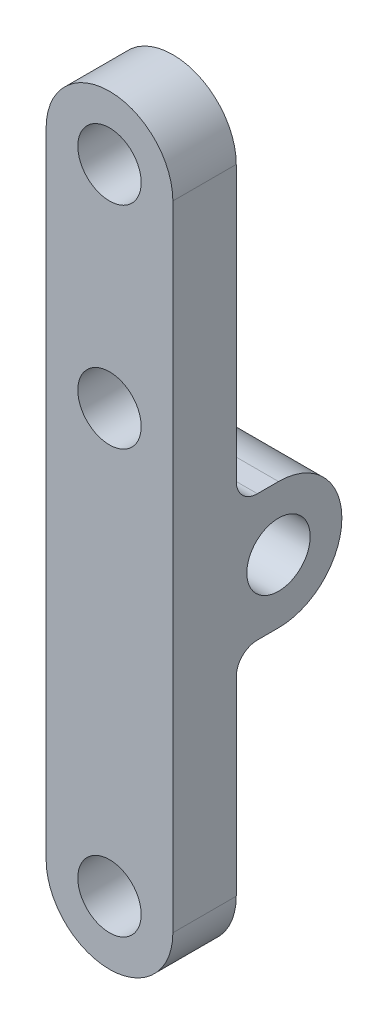
ISO-10303-21;
HEADER;
FILE_DESCRIPTION(('STEP AP214'),'2;1');
FILE_NAME('part.step','',(''),(''),'','','');
FILE_SCHEMA(('AUTOMOTIVE_DESIGN { 1 0 10303 214 1 1 1 1 }'));
ENDSEC;
DATA;
#1=APPLICATION_CONTEXT('core data for automotive mechanical design processes');
#2=APPLICATION_PROTOCOL_DEFINITION('international standard','automotive_design',2000,#1);
#3=PRODUCT_CONTEXT('',#1,'mechanical');
#4=PRODUCT('Part','Part','',(#3));
#5=PRODUCT_RELATED_PRODUCT_CATEGORY('part','',(#4));
#6=PRODUCT_DEFINITION_FORMATION('','',#4);
#7=PRODUCT_DEFINITION_CONTEXT('part definition',#1,'design');
#8=PRODUCT_DEFINITION('design','',#6,#7);
#9=PRODUCT_DEFINITION_SHAPE('','',#8);
#10=(LENGTH_UNIT() NAMED_UNIT(*) SI_UNIT(.MILLI.,.METRE.));
#11=(NAMED_UNIT(*) PLANE_ANGLE_UNIT() SI_UNIT($,.RADIAN.));
#12=(NAMED_UNIT(*) SI_UNIT($,.STERADIAN.) SOLID_ANGLE_UNIT());
#13=UNCERTAINTY_MEASURE_WITH_UNIT(LENGTH_MEASURE(1.E-05),#10,'distance_accuracy_value','');
#14=(GEOMETRIC_REPRESENTATION_CONTEXT(3) GLOBAL_UNCERTAINTY_ASSIGNED_CONTEXT((#13)) GLOBAL_UNIT_ASSIGNED_CONTEXT((#10,
#11,#12)) REPRESENTATION_CONTEXT('',''));
#15=CARTESIAN_POINT('',(0.,0.,0.));
#16=DIRECTION('',(0.,0.,1.));
#17=DIRECTION('',(1.,0.,0.));
#18=AXIS2_PLACEMENT_3D('',#15,#16,#17);
#19=CARTESIAN_POINT('',(0.,0.,-3.));
#20=DIRECTION('',(0.,0.,-1.));
#21=DIRECTION('',(1.,0.,0.));
#22=AXIS2_PLACEMENT_3D('',#19,#20,#21);
#23=PLANE('',#22);
#24=CARTESIAN_POINT('',(0.,-10.,-3.));
#25=DIRECTION('',(0.,0.,1.));
#26=DIRECTION('',(1.,0.,0.));
#27=AXIS2_PLACEMENT_3D('',#24,#25,#26);
#28=CIRCLE('',#27,1.5);
#29=CARTESIAN_POINT('',(1.5,-10.,-3.));
#30=VERTEX_POINT('',#29);
#31=EDGE_CURVE('E218',#30,#30,#28,.T.);
#32=ORIENTED_EDGE('',*,*,#31,.T.);
#33=EDGE_LOOP('',(#32));
#34=FACE_BOUND('',#33,.T.);
#35=DIRECTION('',(0.,-1.,0.));
#36=VECTOR('',#35,1.);
#37=CARTESIAN_POINT('',(-3.,0.,-3.));
#38=LINE('',#37,#36);
#39=CARTESIAN_POINT('',(-3.,0.,-3.));
#40=VERTEX_POINT('',#39);
#41=CARTESIAN_POINT('',(-3.,-13.,-3.));
#42=VERTEX_POINT('',#41);
#43=EDGE_CURVE('E162',#40,#42,#38,.T.);
#44=ORIENTED_EDGE('',*,*,#43,.F.);
#45=CARTESIAN_POINT('',(0.,0.,-3.));
#46=DIRECTION('',(0.,0.,1.));
#47=DIRECTION('',(1.,0.,0.));
#48=AXIS2_PLACEMENT_3D('',#45,#46,#47);
#49=CIRCLE('',#48,3.);
#50=CARTESIAN_POINT('',(3.,0.,-3.));
#51=VERTEX_POINT('',#50);
#52=EDGE_CURVE('E157',#51,#40,#49,.T.);
#53=ORIENTED_EDGE('',*,*,#52,.F.);
#54=DIRECTION('',(0.,1.,0.));
#55=VECTOR('',#54,1.);
#56=CARTESIAN_POINT('',(3.,0.,-3.));
#57=LINE('',#56,#55);
#58=CARTESIAN_POINT('',(3.,-13.,-3.));
#59=VERTEX_POINT('',#58);
#60=EDGE_CURVE('E168',#59,#51,#57,.T.);
#61=ORIENTED_EDGE('',*,*,#60,.F.);
#62=DIRECTION('',(-1.,0.,0.));
#63=VECTOR('',#62,1.);
#64=CARTESIAN_POINT('',(3.,-13.,-3.));
#65=LINE('',#64,#63);
#66=EDGE_CURVE('E196',#42,#59,#65,.F.);
#67=ORIENTED_EDGE('',*,*,#66,.F.);
#68=EDGE_LOOP('',(#44,#53,#61,#67));
#69=FACE_BOUND('',#68,.T.);
#70=CARTESIAN_POINT('',(0.,0.,-3.));
#71=DIRECTION('',(0.,0.,1.));
#72=DIRECTION('',(1.,0.,0.));
#73=AXIS2_PLACEMENT_3D('',#70,#71,#72);
#74=CIRCLE('',#73,1.5);
#75=CARTESIAN_POINT('',(1.5,0.,-3.));
#76=VERTEX_POINT('',#75);
#77=EDGE_CURVE('E151',#76,#76,#74,.T.);
#78=ORIENTED_EDGE('',*,*,#77,.T.);
#79=EDGE_LOOP('',(#78));
#80=FACE_BOUND('',#79,.T.);
#81=ADVANCED_FACE('F35',(#34,#69,#80),#23,.T.);
#82=CARTESIAN_POINT('',(3.,-30.,-3.));
#83=VERTEX_POINT('',#82);
#84=CARTESIAN_POINT('',(3.,-21.,-3.));
#85=VERTEX_POINT('',#84);
#86=EDGE_CURVE('E169',#83,#85,#57,.T.);
#87=ORIENTED_EDGE('',*,*,#86,.F.);
#88=CARTESIAN_POINT('',(0.,-30.,-3.));
#89=DIRECTION('',(0.,0.,1.));
#90=DIRECTION('',(-1.,0.,0.));
#91=AXIS2_PLACEMENT_3D('',#88,#89,#90);
#92=CIRCLE('',#91,3.);
#93=CARTESIAN_POINT('',(-3.,-30.,-3.));
#94=VERTEX_POINT('',#93);
#95=EDGE_CURVE('E165',#94,#83,#92,.T.);
#96=ORIENTED_EDGE('',*,*,#95,.F.);
#97=CARTESIAN_POINT('',(-3.,-21.,-3.));
#98=VERTEX_POINT('',#97);
#99=EDGE_CURVE('E160',#98,#94,#38,.T.);
#100=ORIENTED_EDGE('',*,*,#99,.F.);
#101=DIRECTION('',(1.,0.,0.));
#102=VECTOR('',#101,1.);
#103=CARTESIAN_POINT('',(-3.,-21.,-3.));
#104=LINE('',#103,#102);
#105=EDGE_CURVE('E192',#85,#98,#104,.F.);
#106=ORIENTED_EDGE('',*,*,#105,.F.);
#107=EDGE_LOOP('',(#87,#96,#100,#106));
#108=FACE_BOUND('',#107,.T.);
#109=CARTESIAN_POINT('',(0.,-30.,-3.));
#110=DIRECTION('',(0.,0.,1.));
#111=DIRECTION('',(-1.,0.,0.));
#112=AXIS2_PLACEMENT_3D('',#109,#110,#111);
#113=CIRCLE('',#112,1.5);
#114=CARTESIAN_POINT('',(-1.5,-30.,-3.));
#115=VERTEX_POINT('',#114);
#116=EDGE_CURVE('E145',#115,#115,#113,.T.);
#117=ORIENTED_EDGE('',*,*,#116,.T.);
#118=EDGE_LOOP('',(#117));
#119=FACE_BOUND('',#118,.T.);
#120=ADVANCED_FACE('F241',(#108,#119),#23,.T.);
#121=CARTESIAN_POINT('',(0.,0.,0.));
#122=DIRECTION('',(0.,0.,-1.));
#123=DIRECTION('',(1.,0.,0.));
#124=AXIS2_PLACEMENT_3D('',#121,#122,#123);
#125=PLANE('',#124);
#126=CARTESIAN_POINT('',(0.,-10.,0.));
#127=DIRECTION('',(0.,0.,-1.));
#128=DIRECTION('',(-1.,0.,0.));
#129=AXIS2_PLACEMENT_3D('',#126,#127,#128);
#130=CIRCLE('',#129,1.5);
#131=CARTESIAN_POINT('',(-1.5,-10.,0.));
#132=VERTEX_POINT('',#131);
#133=EDGE_CURVE('E221',#132,#132,#130,.T.);
#134=ORIENTED_EDGE('',*,*,#133,.T.);
#135=EDGE_LOOP('',(#134));
#136=FACE_BOUND('',#135,.T.);
#137=CARTESIAN_POINT('',(0.,-30.,0.));
#138=DIRECTION('',(0.,0.,1.));
#139=DIRECTION('',(-1.,0.,0.));
#140=AXIS2_PLACEMENT_3D('',#137,#138,#139);
#141=CIRCLE('',#140,3.);
#142=CARTESIAN_POINT('',(-3.,-30.,0.));
#143=VERTEX_POINT('',#142);
#144=CARTESIAN_POINT('',(3.,-30.,0.));
#145=VERTEX_POINT('',#144);
#146=EDGE_CURVE('E178',#143,#145,#141,.T.);
#147=ORIENTED_EDGE('',*,*,#146,.T.);
#148=DIRECTION('',(0.,1.,0.));
#149=VECTOR('',#148,1.);
#150=CARTESIAN_POINT('',(3.,0.,0.));
#151=LINE('',#150,#149);
#152=CARTESIAN_POINT('',(3.,0.,0.));
#153=VERTEX_POINT('',#152);
#154=EDGE_CURVE('E161',#145,#153,#151,.T.);
#155=ORIENTED_EDGE('',*,*,#154,.T.);
#156=CARTESIAN_POINT('',(0.,0.,0.));
#157=DIRECTION('',(0.,0.,1.));
#158=DIRECTION('',(1.,0.,0.));
#159=AXIS2_PLACEMENT_3D('',#156,#157,#158);
#160=CIRCLE('',#159,3.);
#161=CARTESIAN_POINT('',(-3.,0.,0.));
#162=VERTEX_POINT('',#161);
#163=EDGE_CURVE('E154',#153,#162,#160,.T.);
#164=ORIENTED_EDGE('',*,*,#163,.T.);
#165=DIRECTION('',(0.,-1.,0.));
#166=VECTOR('',#165,1.);
#167=CARTESIAN_POINT('',(-3.,0.,0.));
#168=LINE('',#167,#166);
#169=EDGE_CURVE('E175',#162,#143,#168,.T.);
#170=ORIENTED_EDGE('',*,*,#169,.T.);
#171=EDGE_LOOP('',(#147,#155,#164,#170));
#172=FACE_BOUND('',#171,.T.);
#173=CARTESIAN_POINT('',(0.,-30.,0.));
#174=DIRECTION('',(0.,0.,1.));
#175=DIRECTION('',(-1.,0.,0.));
#176=AXIS2_PLACEMENT_3D('',#173,#174,#175);
#177=CIRCLE('',#176,1.5);
#178=CARTESIAN_POINT('',(-1.5,-30.,0.));
#179=VERTEX_POINT('',#178);
#180=EDGE_CURVE('E143',#179,#179,#177,.T.);
#181=ORIENTED_EDGE('',*,*,#180,.F.);
#182=EDGE_LOOP('',(#181));
#183=FACE_BOUND('',#182,.T.);
#184=CARTESIAN_POINT('',(0.,0.,0.));
#185=DIRECTION('',(0.,0.,1.));
#186=DIRECTION('',(1.,0.,0.));
#187=AXIS2_PLACEMENT_3D('',#184,#185,#186);
#188=CIRCLE('',#187,1.5);
#189=CARTESIAN_POINT('',(1.5,0.,0.));
#190=VERTEX_POINT('',#189);
#191=EDGE_CURVE('E148',#190,#190,#188,.T.);
#192=ORIENTED_EDGE('',*,*,#191,.F.);
#193=EDGE_LOOP('',(#192));
#194=FACE_BOUND('',#193,.T.);
#195=ADVANCED_FACE('F229',(#136,#172,#183,#194),#125,.F.);
#196=CARTESIAN_POINT('',(0.,0.,-3.));
#197=DIRECTION('',(0.,0.,1.));
#198=DIRECTION('',(-1.,0.,0.));
#199=AXIS2_PLACEMENT_3D('',#196,#197,#198);
#200=CYLINDRICAL_SURFACE('',#199,3.);
#201=ORIENTED_EDGE('',*,*,#163,.F.);
#202=DIRECTION('',(0.,0.,1.));
#203=VECTOR('',#202,1.);
#204=CARTESIAN_POINT('',(3.,0.,-3.));
#205=LINE('',#204,#203);
#206=EDGE_CURVE('E172',#51,#153,#205,.T.);
#207=ORIENTED_EDGE('',*,*,#206,.F.);
#208=ORIENTED_EDGE('',*,*,#52,.T.);
#209=DIRECTION('',(0.,0.,1.));
#210=VECTOR('',#209,1.);
#211=CARTESIAN_POINT('',(-3.,0.,-3.));
#212=LINE('',#211,#210);
#213=EDGE_CURVE('E188',#40,#162,#212,.T.);
#214=ORIENTED_EDGE('',*,*,#213,.T.);
#215=EDGE_LOOP('',(#201,#207,#208,#214));
#216=FACE_BOUND('',#215,.T.);
#217=ADVANCED_FACE('F254',(#216),#200,.T.);
#218=CARTESIAN_POINT('',(-3.,0.,-3.));
#219=DIRECTION('',(1.,0.,0.));
#220=DIRECTION('',(0.,1.,0.));
#221=AXIS2_PLACEMENT_3D('',#218,#219,#220);
#222=PLANE('',#221);
#223=ORIENTED_EDGE('',*,*,#99,.T.);
#224=DIRECTION('',(0.,0.,1.));
#225=VECTOR('',#224,1.);
#226=CARTESIAN_POINT('',(-3.,-30.,-3.));
#227=LINE('',#226,#225);
#228=EDGE_CURVE('E186',#94,#143,#227,.T.);
#229=ORIENTED_EDGE('',*,*,#228,.T.);
#230=ORIENTED_EDGE('',*,*,#169,.F.);
#231=ORIENTED_EDGE('',*,*,#213,.F.);
#232=ORIENTED_EDGE('',*,*,#43,.T.);
#233=CARTESIAN_POINT('',(-3.,-13.,-4.));
#234=DIRECTION('',(-1.,0.,0.));
#235=DIRECTION('',(0.,1.,0.));
#236=AXIS2_PLACEMENT_3D('',#233,#234,#235);
#237=CIRCLE('',#236,1.);
#238=CARTESIAN_POINT('',(-3.,-14.,-4.));
#239=VERTEX_POINT('',#238);
#240=EDGE_CURVE('E43',#239,#42,#237,.T.);
#241=ORIENTED_EDGE('',*,*,#240,.F.);
#242=DIRECTION('',(0.,0.,1.));
#243=VECTOR('',#242,1.);
#244=CARTESIAN_POINT('',(-3.,-14.,0.));
#245=LINE('',#244,#243);
#246=CARTESIAN_POINT('',(-3.,-14.,-5.));
#247=VERTEX_POINT('',#246);
#248=EDGE_CURVE('E144',#247,#239,#245,.T.);
#249=ORIENTED_EDGE('',*,*,#248,.F.);
#250=CARTESIAN_POINT('',(-3.,-17.,-5.));
#251=DIRECTION('',(-1.,0.,0.));
#252=DIRECTION('',(0.,1.,0.));
#253=AXIS2_PLACEMENT_3D('',#250,#251,#252);
#254=CIRCLE('',#253,3.);
#255=CARTESIAN_POINT('',(-3.,-20.,-5.));
#256=VERTEX_POINT('',#255);
#257=EDGE_CURVE('E118',#256,#247,#254,.F.);
#258=ORIENTED_EDGE('',*,*,#257,.F.);
#259=DIRECTION('',(0.,0.,-1.));
#260=VECTOR('',#259,1.);
#261=CARTESIAN_POINT('',(-3.,-20.,-5.));
#262=LINE('',#261,#260);
#263=CARTESIAN_POINT('',(-3.,-20.,-4.));
#264=VERTEX_POINT('',#263);
#265=EDGE_CURVE('E210',#264,#256,#262,.T.);
#266=ORIENTED_EDGE('',*,*,#265,.F.);
#267=CARTESIAN_POINT('',(-3.,-21.,-4.));
#268=DIRECTION('',(-1.,0.,0.));
#269=DIRECTION('',(0.,1.,0.));
#270=AXIS2_PLACEMENT_3D('',#267,#268,#269);
#271=CIRCLE('',#270,1.);
#272=EDGE_CURVE('E200',#98,#264,#271,.T.);
#273=ORIENTED_EDGE('',*,*,#272,.F.);
#274=EDGE_LOOP('',(#223,#229,#230,#231,#232,#241,#249,#258,#266,#273));
#275=FACE_BOUND('',#274,.T.);
#276=CARTESIAN_POINT('',(-3.,-17.,-5.));
#277=DIRECTION('',(-1.,0.,0.));
#278=DIRECTION('',(0.,1.,0.));
#279=AXIS2_PLACEMENT_3D('',#276,#277,#278);
#280=CIRCLE('',#279,1.5);
#281=CARTESIAN_POINT('',(-3.,-15.5,-5.));
#282=VERTEX_POINT('',#281);
#283=EDGE_CURVE('E140',#282,#282,#280,.F.);
#284=ORIENTED_EDGE('',*,*,#283,.T.);
#285=EDGE_LOOP('',(#284));
#286=FACE_BOUND('',#285,.T.);
#287=ADVANCED_FACE('F211',(#275,#286),#222,.F.);
#288=CARTESIAN_POINT('',(0.,-30.,-3.));
#289=DIRECTION('',(0.,0.,1.));
#290=DIRECTION('',(-1.,0.,0.));
#291=AXIS2_PLACEMENT_3D('',#288,#289,#290);
#292=CYLINDRICAL_SURFACE('',#291,3.);
#293=ORIENTED_EDGE('',*,*,#146,.F.);
#294=ORIENTED_EDGE('',*,*,#228,.F.);
#295=ORIENTED_EDGE('',*,*,#95,.T.);
#296=DIRECTION('',(0.,0.,1.));
#297=VECTOR('',#296,1.);
#298=CARTESIAN_POINT('',(3.,-30.,-3.));
#299=LINE('',#298,#297);
#300=EDGE_CURVE('E184',#83,#145,#299,.T.);
#301=ORIENTED_EDGE('',*,*,#300,.T.);
#302=EDGE_LOOP('',(#293,#294,#295,#301));
#303=FACE_BOUND('',#302,.T.);
#304=ADVANCED_FACE('F257',(#303),#292,.T.);
#305=CARTESIAN_POINT('',(3.,0.,-3.));
#306=DIRECTION('',(-1.,0.,0.));
#307=DIRECTION('',(0.,-1.,0.));
#308=AXIS2_PLACEMENT_3D('',#305,#306,#307);
#309=PLANE('',#308);
#310=ORIENTED_EDGE('',*,*,#154,.F.);
#311=ORIENTED_EDGE('',*,*,#300,.F.);
#312=ORIENTED_EDGE('',*,*,#86,.T.);
#313=CARTESIAN_POINT('',(3.,-21.,-4.));
#314=DIRECTION('',(1.,0.,0.));
#315=DIRECTION('',(0.,-1.,0.));
#316=AXIS2_PLACEMENT_3D('',#313,#314,#315);
#317=CIRCLE('',#316,1.);
#318=CARTESIAN_POINT('',(3.,-20.,-4.));
#319=VERTEX_POINT('',#318);
#320=EDGE_CURVE('E198',#319,#85,#317,.T.);
#321=ORIENTED_EDGE('',*,*,#320,.F.);
#322=DIRECTION('',(0.,0.,1.));
#323=VECTOR('',#322,1.);
#324=CARTESIAN_POINT('',(3.,-20.,-5.));
#325=LINE('',#324,#323);
#326=CARTESIAN_POINT('',(3.,-20.,-5.));
#327=VERTEX_POINT('',#326);
#328=EDGE_CURVE('E123',#327,#319,#325,.T.);
#329=ORIENTED_EDGE('',*,*,#328,.F.);
#330=CARTESIAN_POINT('',(3.,-17.,-5.));
#331=DIRECTION('',(-1.,0.,0.));
#332=DIRECTION('',(0.,-1.,0.));
#333=AXIS2_PLACEMENT_3D('',#330,#331,#332);
#334=CIRCLE('',#333,3.);
#335=CARTESIAN_POINT('',(3.,-14.,-5.));
#336=VERTEX_POINT('',#335);
#337=EDGE_CURVE('E115',#336,#327,#334,.T.);
#338=ORIENTED_EDGE('',*,*,#337,.F.);
#339=DIRECTION('',(0.,0.,-1.));
#340=VECTOR('',#339,1.);
#341=CARTESIAN_POINT('',(3.,-14.,0.));
#342=LINE('',#341,#340);
#343=CARTESIAN_POINT('',(3.,-14.,-4.));
#344=VERTEX_POINT('',#343);
#345=EDGE_CURVE('E125',#344,#336,#342,.T.);
#346=ORIENTED_EDGE('',*,*,#345,.F.);
#347=CARTESIAN_POINT('',(3.,-13.,-4.));
#348=DIRECTION('',(1.,0.,0.));
#349=DIRECTION('',(0.,-1.,0.));
#350=AXIS2_PLACEMENT_3D('',#347,#348,#349);
#351=CIRCLE('',#350,1.);
#352=EDGE_CURVE('E11',#59,#344,#351,.T.);
#353=ORIENTED_EDGE('',*,*,#352,.F.);
#354=ORIENTED_EDGE('',*,*,#60,.T.);
#355=ORIENTED_EDGE('',*,*,#206,.T.);
#356=EDGE_LOOP('',(#310,#311,#312,#321,#329,#338,#346,#353,#354,#355));
#357=FACE_BOUND('',#356,.T.);
#358=CARTESIAN_POINT('',(3.,-17.,-5.));
#359=DIRECTION('',(-1.,0.,0.));
#360=DIRECTION('',(0.,1.,0.));
#361=AXIS2_PLACEMENT_3D('',#358,#359,#360);
#362=CIRCLE('',#361,1.5);
#363=CARTESIAN_POINT('',(3.,-15.5,-5.));
#364=VERTEX_POINT('',#363);
#365=EDGE_CURVE('E128',#364,#364,#362,.T.);
#366=ORIENTED_EDGE('',*,*,#365,.T.);
#367=EDGE_LOOP('',(#366));
#368=FACE_BOUND('',#367,.T.);
#369=ADVANCED_FACE('F131',(#357,#368),#309,.F.);
#370=CARTESIAN_POINT('',(0.,0.,-3.));
#371=DIRECTION('',(0.,0.,1.));
#372=DIRECTION('',(-1.,0.,0.));
#373=AXIS2_PLACEMENT_3D('',#370,#371,#372);
#374=CYLINDRICAL_SURFACE('',#373,1.5);
#375=ORIENTED_EDGE('',*,*,#77,.F.);
#376=EDGE_LOOP('',(#375));
#377=FACE_BOUND('',#376,.T.);
#378=ORIENTED_EDGE('',*,*,#191,.T.);
#379=EDGE_LOOP('',(#378));
#380=FACE_BOUND('',#379,.T.);
#381=ADVANCED_FACE('F250',(#377,#380),#374,.F.);
#382=CARTESIAN_POINT('',(0.,-30.,-3.));
#383=DIRECTION('',(0.,0.,1.));
#384=DIRECTION('',(-1.,0.,0.));
#385=AXIS2_PLACEMENT_3D('',#382,#383,#384);
#386=CYLINDRICAL_SURFACE('',#385,1.5);
#387=ORIENTED_EDGE('',*,*,#116,.F.);
#388=EDGE_LOOP('',(#387));
#389=FACE_BOUND('',#388,.T.);
#390=ORIENTED_EDGE('',*,*,#180,.T.);
#391=EDGE_LOOP('',(#390));
#392=FACE_BOUND('',#391,.T.);
#393=ADVANCED_FACE('F282',(#389,#392),#386,.F.);
#394=CARTESIAN_POINT('',(-13.,-14.,0.));
#395=DIRECTION('',(0.,1.,0.));
#396=DIRECTION('',(-1.,0.,0.));
#397=AXIS2_PLACEMENT_3D('',#394,#395,#396);
#398=PLANE('',#397);
#399=ORIENTED_EDGE('',*,*,#345,.T.);
#400=DIRECTION('',(1.,0.,0.));
#401=VECTOR('',#400,1.);
#402=CARTESIAN_POINT('',(-13.,-14.,-5.));
#403=LINE('',#402,#401);
#404=EDGE_CURVE('E111',#247,#336,#403,.T.);
#405=ORIENTED_EDGE('',*,*,#404,.F.);
#406=ORIENTED_EDGE('',*,*,#248,.T.);
#407=DIRECTION('',(-1.,0.,0.));
#408=VECTOR('',#407,1.);
#409=CARTESIAN_POINT('',(-3.,-14.,-4.));
#410=LINE('',#409,#408);
#411=EDGE_CURVE('E127',#344,#239,#410,.T.);
#412=ORIENTED_EDGE('',*,*,#411,.F.);
#413=EDGE_LOOP('',(#399,#405,#406,#412));
#414=FACE_BOUND('',#413,.T.);
#415=ADVANCED_FACE('F126',(#414),#398,.T.);
#416=CARTESIAN_POINT('',(-13.,-17.,-5.));
#417=DIRECTION('',(1.,0.,0.));
#418=DIRECTION('',(0.,1.,0.));
#419=AXIS2_PLACEMENT_3D('',#416,#417,#418);
#420=CYLINDRICAL_SURFACE('',#419,3.);
#421=ORIENTED_EDGE('',*,*,#257,.T.);
#422=ORIENTED_EDGE('',*,*,#404,.T.);
#423=ORIENTED_EDGE('',*,*,#337,.T.);
#424=DIRECTION('',(1.,0.,0.));
#425=VECTOR('',#424,1.);
#426=CARTESIAN_POINT('',(-13.,-20.,-5.));
#427=LINE('',#426,#425);
#428=EDGE_CURVE('E122',#256,#327,#427,.T.);
#429=ORIENTED_EDGE('',*,*,#428,.F.);
#430=EDGE_LOOP('',(#421,#422,#423,#429));
#431=FACE_BOUND('',#430,.T.);
#432=ADVANCED_FACE('F113',(#431),#420,.T.);
#433=CARTESIAN_POINT('',(-13.,-20.,-5.));
#434=DIRECTION('',(0.,-1.,0.));
#435=DIRECTION('',(1.,0.,0.));
#436=AXIS2_PLACEMENT_3D('',#433,#434,#435);
#437=PLANE('',#436);
#438=ORIENTED_EDGE('',*,*,#265,.T.);
#439=ORIENTED_EDGE('',*,*,#428,.T.);
#440=ORIENTED_EDGE('',*,*,#328,.T.);
#441=DIRECTION('',(1.,0.,0.));
#442=VECTOR('',#441,1.);
#443=CARTESIAN_POINT('',(3.,-20.,-4.));
#444=LINE('',#443,#442);
#445=EDGE_CURVE('E190',#264,#319,#444,.T.);
#446=ORIENTED_EDGE('',*,*,#445,.F.);
#447=EDGE_LOOP('',(#438,#439,#440,#446));
#448=FACE_BOUND('',#447,.T.);
#449=ADVANCED_FACE('F270',(#448),#437,.T.);
#450=CARTESIAN_POINT('',(-13.,-17.,-5.));
#451=DIRECTION('',(1.,0.,0.));
#452=DIRECTION('',(0.,1.,0.));
#453=AXIS2_PLACEMENT_3D('',#450,#451,#452);
#454=CYLINDRICAL_SURFACE('',#453,1.5);
#455=ORIENTED_EDGE('',*,*,#283,.F.);
#456=EDGE_LOOP('',(#455));
#457=FACE_BOUND('',#456,.T.);
#458=ORIENTED_EDGE('',*,*,#365,.F.);
#459=EDGE_LOOP('',(#458));
#460=FACE_BOUND('',#459,.T.);
#461=ADVANCED_FACE('F266',(#457,#460),#454,.F.);
#462=CARTESIAN_POINT('',(-13.,-21.,-4.));
#463=DIRECTION('',(-1.,0.,0.));
#464=DIRECTION('',(0.,-1.,0.));
#465=AXIS2_PLACEMENT_3D('',#462,#463,#464);
#466=CYLINDRICAL_SURFACE('',#465,1.);
#467=ORIENTED_EDGE('',*,*,#272,.T.);
#468=ORIENTED_EDGE('',*,*,#445,.T.);
#469=ORIENTED_EDGE('',*,*,#320,.T.);
#470=ORIENTED_EDGE('',*,*,#105,.T.);
#471=EDGE_LOOP('',(#467,#468,#469,#470));
#472=FACE_BOUND('',#471,.T.);
#473=ADVANCED_FACE('F204',(#472),#466,.F.);
#474=CARTESIAN_POINT('',(-13.,-13.,-4.));
#475=DIRECTION('',(1.,0.,0.));
#476=DIRECTION('',(0.,1.,0.));
#477=AXIS2_PLACEMENT_3D('',#474,#475,#476);
#478=CYLINDRICAL_SURFACE('',#477,1.);
#479=ORIENTED_EDGE('',*,*,#352,.T.);
#480=ORIENTED_EDGE('',*,*,#411,.T.);
#481=ORIENTED_EDGE('',*,*,#240,.T.);
#482=ORIENTED_EDGE('',*,*,#66,.T.);
#483=EDGE_LOOP('',(#479,#480,#481,#482));
#484=FACE_BOUND('',#483,.T.);
#485=ADVANCED_FACE('F37',(#484),#478,.F.);
#486=CARTESIAN_POINT('',(0.,-10.,-10.));
#487=DIRECTION('',(0.,0.,1.));
#488=DIRECTION('',(-1.,0.,0.));
#489=AXIS2_PLACEMENT_3D('',#486,#487,#488);
#490=CYLINDRICAL_SURFACE('',#489,1.5);
#491=ORIENTED_EDGE('',*,*,#31,.F.);
#492=EDGE_LOOP('',(#491));
#493=FACE_BOUND('',#492,.T.);
#494=ORIENTED_EDGE('',*,*,#133,.F.);
#495=EDGE_LOOP('',(#494));
#496=FACE_BOUND('',#495,.T.);
#497=ADVANCED_FACE('F232',(#493,#496),#490,.F.);
#498=CLOSED_SHELL('',(#81,#120,#195,#217,#287,#304,#369,#381,#393,#415,#432,#449,#461,#473,#485,#497));
#499=MANIFOLD_SOLID_BREP('B2',#498);
#500=ADVANCED_BREP_SHAPE_REPRESENTATION('',(#18,#499),#14);
#501=SHAPE_DEFINITION_REPRESENTATION(#9,#500);
ENDSEC;
END-ISO-10303-21;
